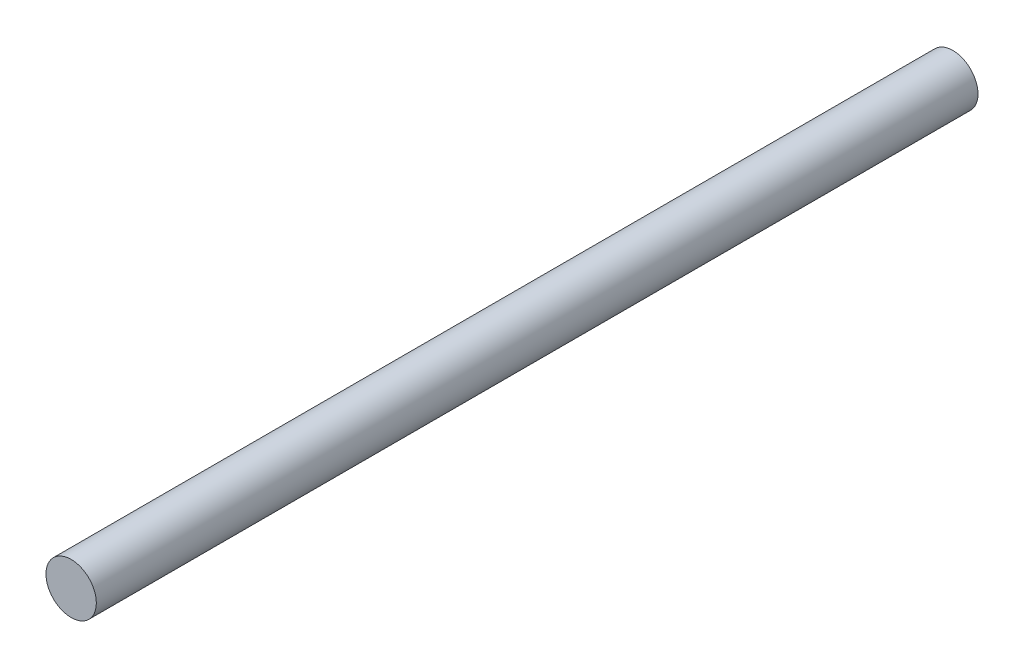
ISO-10303-21;
HEADER;
FILE_DESCRIPTION(('STEP AP214'),'2;1');
FILE_NAME('part.step','',(''),(''),'','','');
FILE_SCHEMA(('AUTOMOTIVE_DESIGN { 1 0 10303 214 1 1 1 1 }'));
ENDSEC;
DATA;
#1=APPLICATION_CONTEXT('core data for automotive mechanical design processes');
#2=APPLICATION_PROTOCOL_DEFINITION('international standard','automotive_design',2000,#1);
#3=PRODUCT_CONTEXT('',#1,'mechanical');
#4=PRODUCT('Part','Part','',(#3));
#5=PRODUCT_RELATED_PRODUCT_CATEGORY('part','',(#4));
#6=PRODUCT_DEFINITION_FORMATION('','',#4);
#7=PRODUCT_DEFINITION_CONTEXT('part definition',#1,'design');
#8=PRODUCT_DEFINITION('design','',#6,#7);
#9=PRODUCT_DEFINITION_SHAPE('','',#8);
#10=(LENGTH_UNIT() NAMED_UNIT(*) SI_UNIT(.MILLI.,.METRE.));
#11=(NAMED_UNIT(*) PLANE_ANGLE_UNIT() SI_UNIT($,.RADIAN.));
#12=(NAMED_UNIT(*) SI_UNIT($,.STERADIAN.) SOLID_ANGLE_UNIT());
#13=UNCERTAINTY_MEASURE_WITH_UNIT(LENGTH_MEASURE(1.E-05),#10,'distance_accuracy_value','');
#14=(GEOMETRIC_REPRESENTATION_CONTEXT(3) GLOBAL_UNCERTAINTY_ASSIGNED_CONTEXT((#13)) GLOBAL_UNIT_ASSIGNED_CONTEXT((#10,
#11,#12)) REPRESENTATION_CONTEXT('',''));
#15=CARTESIAN_POINT('',(0.,0.,0.));
#16=DIRECTION('',(0.,0.,1.));
#17=DIRECTION('',(1.,0.,0.));
#18=AXIS2_PLACEMENT_3D('',#15,#16,#17);
#19=CARTESIAN_POINT('',(0.,0.,87.5));
#20=DIRECTION('',(0.,0.,-1.));
#21=DIRECTION('',(-1.,0.,0.));
#22=AXIS2_PLACEMENT_3D('',#19,#20,#21);
#23=CYLINDRICAL_SURFACE('',#22,5.);
#24=CARTESIAN_POINT('',(0.,0.,87.5));
#25=DIRECTION('',(0.,0.,1.));
#26=DIRECTION('',(1.,0.,0.));
#27=AXIS2_PLACEMENT_3D('',#24,#25,#26);
#28=CIRCLE('',#27,5.);
#29=CARTESIAN_POINT('',(5.,0.,87.5));
#30=VERTEX_POINT('',#29);
#31=EDGE_CURVE('E10',#30,#30,#28,.T.);
#32=ORIENTED_EDGE('',*,*,#31,.F.);
#33=EDGE_LOOP('',(#32));
#34=FACE_BOUND('',#33,.T.);
#35=CARTESIAN_POINT('',(0.,0.,-87.5));
#36=DIRECTION('',(0.,0.,1.));
#37=DIRECTION('',(1.,0.,0.));
#38=AXIS2_PLACEMENT_3D('',#35,#36,#37);
#39=CIRCLE('',#38,5.);
#40=CARTESIAN_POINT('',(5.,0.,-87.5));
#41=VERTEX_POINT('',#40);
#42=EDGE_CURVE('E36',#41,#41,#39,.T.);
#43=ORIENTED_EDGE('',*,*,#42,.T.);
#44=EDGE_LOOP('',(#43));
#45=FACE_BOUND('',#44,.T.);
#46=ADVANCED_FACE('F33',(#34,#45),#23,.T.);
#47=CARTESIAN_POINT('',(0.,0.,87.5));
#48=DIRECTION('',(0.,0.,1.));
#49=DIRECTION('',(1.,0.,0.));
#50=AXIS2_PLACEMENT_3D('',#47,#48,#49);
#51=PLANE('',#50);
#52=ORIENTED_EDGE('',*,*,#31,.T.);
#53=EDGE_LOOP('',(#52));
#54=FACE_BOUND('',#53,.T.);
#55=ADVANCED_FACE('F48',(#54),#51,.T.);
#56=CARTESIAN_POINT('',(0.,0.,-87.5));
#57=DIRECTION('',(0.,0.,1.));
#58=DIRECTION('',(1.,0.,0.));
#59=AXIS2_PLACEMENT_3D('',#56,#57,#58);
#60=PLANE('',#59);
#61=ORIENTED_EDGE('',*,*,#42,.F.);
#62=EDGE_LOOP('',(#61));
#63=FACE_BOUND('',#62,.T.);
#64=ADVANCED_FACE('F46',(#63),#60,.F.);
#65=CLOSED_SHELL('',(#46,#55,#64));
#66=MANIFOLD_SOLID_BREP('B2',#65);
#67=ADVANCED_BREP_SHAPE_REPRESENTATION('',(#18,#66),#14);
#68=SHAPE_DEFINITION_REPRESENTATION(#9,#67);
ENDSEC;
END-ISO-10303-21;
